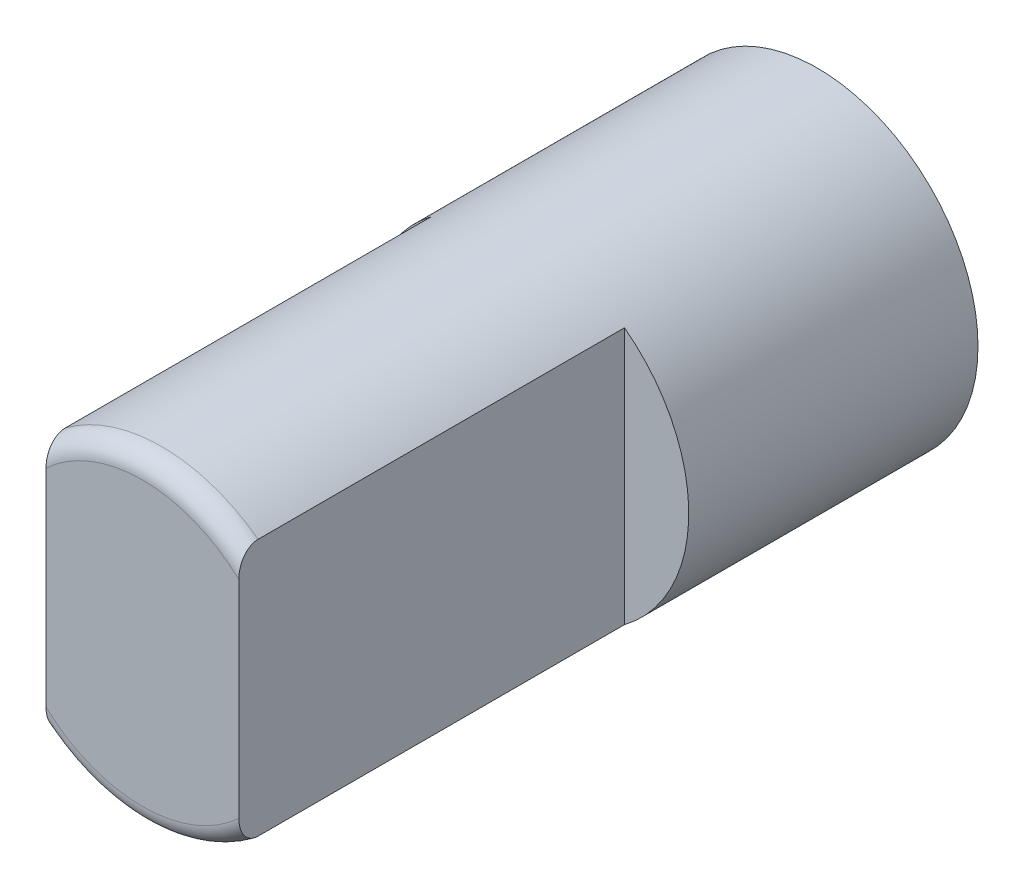
ISO-10303-21;
HEADER;
FILE_DESCRIPTION(('STEP AP214'),'2;1');
FILE_NAME('part.step','',(''),(''),'','','');
FILE_SCHEMA(('AUTOMOTIVE_DESIGN { 1 0 10303 214 1 1 1 1 }'));
ENDSEC;
DATA;
#1=APPLICATION_CONTEXT('core data for automotive mechanical design processes');
#2=APPLICATION_PROTOCOL_DEFINITION('international standard','automotive_design',2000,#1);
#3=PRODUCT_CONTEXT('',#1,'mechanical');
#4=PRODUCT('Part','Part','',(#3));
#5=PRODUCT_RELATED_PRODUCT_CATEGORY('part','',(#4));
#6=PRODUCT_DEFINITION_FORMATION('','',#4);
#7=PRODUCT_DEFINITION_CONTEXT('part definition',#1,'design');
#8=PRODUCT_DEFINITION('design','',#6,#7);
#9=PRODUCT_DEFINITION_SHAPE('','',#8);
#10=(LENGTH_UNIT() NAMED_UNIT(*) SI_UNIT(.MILLI.,.METRE.));
#11=(NAMED_UNIT(*) PLANE_ANGLE_UNIT() SI_UNIT($,.RADIAN.));
#12=(NAMED_UNIT(*) SI_UNIT($,.STERADIAN.) SOLID_ANGLE_UNIT());
#13=UNCERTAINTY_MEASURE_WITH_UNIT(LENGTH_MEASURE(1.E-05),#10,'distance_accuracy_value','');
#14=(GEOMETRIC_REPRESENTATION_CONTEXT(3) GLOBAL_UNCERTAINTY_ASSIGNED_CONTEXT((#13)) GLOBAL_UNIT_ASSIGNED_CONTEXT((#10,
#11,#12)) REPRESENTATION_CONTEXT('',''));
#15=CARTESIAN_POINT('',(0.,0.,0.));
#16=DIRECTION('',(0.,0.,1.));
#17=DIRECTION('',(1.,0.,0.));
#18=AXIS2_PLACEMENT_3D('',#15,#16,#17);
#19=CARTESIAN_POINT('',(0.,0.,10.5));
#20=DIRECTION('',(0.,0.,-1.));
#21=DIRECTION('',(-1.,0.,0.));
#22=AXIS2_PLACEMENT_3D('',#19,#20,#21);
#23=CYLINDRICAL_SURFACE('',#22,2.5);
#24=DIRECTION('',(0.,0.,1.));
#25=VECTOR('',#24,1.);
#26=CARTESIAN_POINT('',(-1.5,2.,4.5));
#27=LINE('',#26,#25);
#28=CARTESIAN_POINT('',(-1.5,2.,4.5));
#29=VERTEX_POINT('',#28);
#30=CARTESIAN_POINT('',(-1.5,2.,10.2));
#31=VERTEX_POINT('',#30);
#32=EDGE_CURVE('E120',#29,#31,#27,.T.);
#33=ORIENTED_EDGE('',*,*,#32,.T.);
#34=CARTESIAN_POINT('',(0.,0.,10.2));
#35=DIRECTION('',(0.,0.,1.));
#36=DIRECTION('',(1.,0.,0.));
#37=AXIS2_PLACEMENT_3D('',#34,#35,#36);
#38=CIRCLE('',#37,2.5);
#39=CARTESIAN_POINT('',(1.5,2.,10.2));
#40=VERTEX_POINT('',#39);
#41=EDGE_CURVE('E64',#31,#40,#38,.F.);
#42=ORIENTED_EDGE('',*,*,#41,.T.);
#43=DIRECTION('',(0.,0.,1.));
#44=VECTOR('',#43,1.);
#45=CARTESIAN_POINT('',(1.5,2.,4.5));
#46=LINE('',#45,#44);
#47=CARTESIAN_POINT('',(1.5,2.,4.5));
#48=VERTEX_POINT('',#47);
#49=EDGE_CURVE('E102',#48,#40,#46,.T.);
#50=ORIENTED_EDGE('',*,*,#49,.F.);
#51=CARTESIAN_POINT('',(0.,0.,4.5));
#52=DIRECTION('',(0.,0.,1.));
#53=DIRECTION('',(1.,0.,0.));
#54=AXIS2_PLACEMENT_3D('',#51,#52,#53);
#55=CIRCLE('',#54,2.5);
#56=CARTESIAN_POINT('',(1.5,-2.,4.5));
#57=VERTEX_POINT('',#56);
#58=EDGE_CURVE('E95',#57,#48,#55,.T.);
#59=ORIENTED_EDGE('',*,*,#58,.F.);
#60=DIRECTION('',(0.,0.,1.));
#61=VECTOR('',#60,1.);
#62=CARTESIAN_POINT('',(1.5,-2.,4.5));
#63=LINE('',#62,#61);
#64=CARTESIAN_POINT('',(1.5,-2.,10.2));
#65=VERTEX_POINT('',#64);
#66=EDGE_CURVE('E104',#57,#65,#63,.T.);
#67=ORIENTED_EDGE('',*,*,#66,.T.);
#68=CARTESIAN_POINT('',(0.,0.,10.2));
#69=DIRECTION('',(0.,0.,1.));
#70=DIRECTION('',(1.,0.,0.));
#71=AXIS2_PLACEMENT_3D('',#68,#69,#70);
#72=CIRCLE('',#71,2.5);
#73=CARTESIAN_POINT('',(-1.5,-2.,10.2));
#74=VERTEX_POINT('',#73);
#75=EDGE_CURVE('E178',#65,#74,#72,.F.);
#76=ORIENTED_EDGE('',*,*,#75,.T.);
#77=DIRECTION('',(0.,0.,1.));
#78=VECTOR('',#77,1.);
#79=CARTESIAN_POINT('',(-1.5,-2.,4.5));
#80=LINE('',#79,#78);
#81=CARTESIAN_POINT('',(-1.5,-2.,4.5));
#82=VERTEX_POINT('',#81);
#83=EDGE_CURVE('E117',#82,#74,#80,.T.);
#84=ORIENTED_EDGE('',*,*,#83,.F.);
#85=CARTESIAN_POINT('',(0.,0.,4.5));
#86=DIRECTION('',(0.,0.,1.));
#87=DIRECTION('',(1.,0.,0.));
#88=AXIS2_PLACEMENT_3D('',#85,#86,#87);
#89=CIRCLE('',#88,2.5);
#90=EDGE_CURVE('E112',#29,#82,#89,.T.);
#91=ORIENTED_EDGE('',*,*,#90,.F.);
#92=EDGE_LOOP('',(#33,#42,#50,#59,#67,#76,#84,#91));
#93=FACE_BOUND('',#92,.T.);
#94=CARTESIAN_POINT('',(0.,0.,0.));
#95=DIRECTION('',(0.,0.,1.));
#96=DIRECTION('',(1.,0.,0.));
#97=AXIS2_PLACEMENT_3D('',#94,#95,#96);
#98=CIRCLE('',#97,2.5);
#99=CARTESIAN_POINT('',(2.5,0.,0.));
#100=VERTEX_POINT('',#99);
#101=EDGE_CURVE('E122',#100,#100,#98,.T.);
#102=ORIENTED_EDGE('',*,*,#101,.T.);
#103=EDGE_LOOP('',(#102));
#104=FACE_BOUND('',#103,.T.);
#105=ADVANCED_FACE('F37',(#93,#104),#23,.T.);
#106=CARTESIAN_POINT('',(0.,0.,10.5));
#107=DIRECTION('',(0.,0.,1.));
#108=DIRECTION('',(1.,0.,0.));
#109=AXIS2_PLACEMENT_3D('',#106,#107,#108);
#110=PLANE('',#109);
#111=DIRECTION('',(0.,-1.,0.));
#112=VECTOR('',#111,1.);
#113=CARTESIAN_POINT('',(1.5,2.,10.5));
#114=LINE('',#113,#112);
#115=CARTESIAN_POINT('',(1.5,1.60934769394311,10.5));
#116=VERTEX_POINT('',#115);
#117=CARTESIAN_POINT('',(1.5,-1.60934769394311,10.5));
#118=VERTEX_POINT('',#117);
#119=EDGE_CURVE('E99',#116,#118,#114,.T.);
#120=ORIENTED_EDGE('',*,*,#119,.F.);
#121=CARTESIAN_POINT('',(0.,0.,10.5));
#122=DIRECTION('',(0.,0.,1.));
#123=DIRECTION('',(1.,0.,0.));
#124=AXIS2_PLACEMENT_3D('',#121,#122,#123);
#125=CIRCLE('',#124,2.2);
#126=CARTESIAN_POINT('',(-1.5,1.60934769394311,10.5));
#127=VERTEX_POINT('',#126);
#128=EDGE_CURVE('E130',#116,#127,#125,.T.);
#129=ORIENTED_EDGE('',*,*,#128,.T.);
#130=DIRECTION('',(0.,1.,0.));
#131=VECTOR('',#130,1.);
#132=CARTESIAN_POINT('',(-1.5,-2.,10.5));
#133=LINE('',#132,#131);
#134=CARTESIAN_POINT('',(-1.5,-1.60934769394311,10.5));
#135=VERTEX_POINT('',#134);
#136=EDGE_CURVE('E108',#135,#127,#133,.T.);
#137=ORIENTED_EDGE('',*,*,#136,.F.);
#138=CARTESIAN_POINT('',(0.,0.,10.5));
#139=DIRECTION('',(0.,0.,1.));
#140=DIRECTION('',(1.,0.,0.));
#141=AXIS2_PLACEMENT_3D('',#138,#139,#140);
#142=CIRCLE('',#141,2.2);
#143=EDGE_CURVE('E127',#135,#118,#142,.T.);
#144=ORIENTED_EDGE('',*,*,#143,.T.);
#145=EDGE_LOOP('',(#120,#129,#137,#144));
#146=FACE_BOUND('',#145,.T.);
#147=ADVANCED_FACE('F152',(#146),#110,.T.);
#148=CARTESIAN_POINT('',(0.,0.,0.));
#149=DIRECTION('',(0.,0.,1.));
#150=DIRECTION('',(1.,0.,0.));
#151=AXIS2_PLACEMENT_3D('',#148,#149,#150);
#152=PLANE('',#151);
#153=ORIENTED_EDGE('',*,*,#101,.F.);
#154=EDGE_LOOP('',(#153));
#155=FACE_BOUND('',#154,.T.);
#156=ADVANCED_FACE('F150',(#155),#152,.F.);
#157=CARTESIAN_POINT('',(-1.5,-2.,4.5));
#158=DIRECTION('',(1.,0.,0.));
#159=DIRECTION('',(0.,0.,-1.));
#160=AXIS2_PLACEMENT_3D('',#157,#158,#159);
#161=PLANE('',#160);
#162=ORIENTED_EDGE('',*,*,#136,.T.);
#163=CARTESIAN_POINT('',(-1.5,1.60934769394311,10.5));
#164=CARTESIAN_POINT('',(-1.5,1.63455756088802,10.4999930365524));
#165=CARTESIAN_POINT('',(-1.5,1.65983567369953,10.4982965539345));
#166=CARTESIAN_POINT('',(-1.5,1.71006444420656,10.4911978020638));
#167=CARTESIAN_POINT('',(-1.5,1.73501082564339,10.485765800347));
#168=CARTESIAN_POINT('',(-1.5,1.78015920378003,10.4719391103205));
#169=CARTESIAN_POINT('',(-1.5,1.80052499490785,10.4640875692299));
#170=CARTESIAN_POINT('',(-1.5,1.83971397031135,10.4452521364515));
#171=CARTESIAN_POINT('',(-1.5,1.85854156598494,10.4342776383488));
#172=CARTESIAN_POINT('',(-1.5,1.89041710668386,10.4115782676907));
#173=CARTESIAN_POINT('',(-1.5,1.90387281174314,10.4004275954057));
#174=CARTESIAN_POINT('',(-1.5,1.92879524167868,10.3760722511314));
#175=CARTESIAN_POINT('',(-1.5,1.94026321503409,10.3628688783869));
#176=CARTESIAN_POINT('',(-1.5,1.95908459464518,10.3367361609004));
#177=CARTESIAN_POINT('',(-1.5,1.96679780893242,10.3240664290926));
#178=CARTESIAN_POINT('',(-1.5,1.98000101437779,10.2976250572571));
#179=CARTESIAN_POINT('',(-1.5,1.98549441608471,10.2838551468498));
#180=CARTESIAN_POINT('',(-1.5,1.99309951243727,10.2584335740684));
#181=CARTESIAN_POINT('',(-1.5,1.99567095993214,10.2469182805731));
#182=CARTESIAN_POINT('',(-1.5,1.99912887456355,10.2236061892701));
#183=CARTESIAN_POINT('',(-1.5,2.00001067938499,10.2118087032326));
#184=CARTESIAN_POINT('',(-1.5,2.,10.2));
#185=B_SPLINE_CURVE_WITH_KNOTS('',3,(#163,#164,#165,#166,#167,#168,#169,#170,#171,#172,#173,
#174,#175,#176,#177,#178,#179,#180,#181,#182,#183,#184),.UNSPECIFIED.,.F.,.F.,(4,2,2,2,2,2,2,2,
2,2,4),(0.,0.0756831664616083,0.151975804988488,0.217216943562001,0.282263879933907,
0.334490581993891,0.386684361045045,0.43099770793193,0.475242709959179,0.510519640253401,
0.545893772543511),.UNSPECIFIED.);
#186=EDGE_CURVE('E139',#127,#31,#185,.T.);
#187=ORIENTED_EDGE('',*,*,#186,.T.);
#188=ORIENTED_EDGE('',*,*,#32,.F.);
#189=DIRECTION('',(0.,1.,0.));
#190=VECTOR('',#189,1.);
#191=CARTESIAN_POINT('',(-1.5,-2.,4.5));
#192=LINE('',#191,#190);
#193=EDGE_CURVE('E114',#82,#29,#192,.T.);
#194=ORIENTED_EDGE('',*,*,#193,.F.);
#195=ORIENTED_EDGE('',*,*,#83,.T.);
#196=CARTESIAN_POINT('',(-1.5,-2.,10.2));
#197=CARTESIAN_POINT('',(-1.5,-2.00002517455878,10.2144056996334));
#198=CARTESIAN_POINT('',(-1.5,-1.99870486599517,10.2287902734827));
#199=CARTESIAN_POINT('',(-1.5,-1.99358070321942,10.2570308291312));
#200=CARTESIAN_POINT('',(-1.5,-1.98979069108125,10.2708893041524));
#201=CARTESIAN_POINT('',(-1.5,-1.97993698735774,10.2977426754332));
#202=CARTESIAN_POINT('',(-1.5,-1.97387630854318,10.3107386892477));
#203=CARTESIAN_POINT('',(-1.5,-1.95978432211314,10.3356228880546));
#204=CARTESIAN_POINT('',(-1.5,-1.9517507082177,10.3475097538949));
#205=CARTESIAN_POINT('',(-1.5,-1.93348662795761,10.3706924605465));
#206=CARTESIAN_POINT('',(-1.5,-1.92314966060003,10.381903914782));
#207=CARTESIAN_POINT('',(-1.5,-1.90101243976691,10.4027555610775));
#208=CARTESIAN_POINT('',(-1.5,-1.88921201923138,10.4123955734589));
#209=CARTESIAN_POINT('',(-1.5,-1.85874706020155,10.4341885855466));
#210=CARTESIAN_POINT('',(-1.5,-1.83943396820596,10.4454387541662));
#211=CARTESIAN_POINT('',(-1.5,-1.79919162836747,10.4646739873788));
#212=CARTESIAN_POINT('',(-1.5,-1.77825631616834,10.4726460208116));
#213=CARTESIAN_POINT('',(-1.5,-1.73288707269971,10.486260588626));
#214=CARTESIAN_POINT('',(-1.5,-1.70833590606525,10.4915056696061));
#215=CARTESIAN_POINT('',(-1.5,-1.65894868973323,10.4983557383456));
#216=CARTESIAN_POINT('',(-1.5,-1.63411722198948,10.4999932051289));
#217=CARTESIAN_POINT('',(-1.5,-1.60934769394311,10.5));
#218=B_SPLINE_CURVE_WITH_KNOTS('',3,(#196,#197,#198,#199,#200,#201,#202,#203,#204,#205,#206,
#207,#208,#209,#210,#211,#212,#213,#214,#215,#216,#217),.UNSPECIFIED.,.F.,.F.,(4,2,2,2,2,2,2,2,
2,2,4),(0.,0.0431233888911273,0.086007136978675,0.128834186314012,0.171711539014381,
0.217289611231089,0.262872891194265,0.329559981731445,0.396509660474081,0.471542406056419,
0.545896829848013),.UNSPECIFIED.);
#219=EDGE_CURVE('E133',#74,#135,#218,.T.);
#220=ORIENTED_EDGE('',*,*,#219,.T.);
#221=EDGE_LOOP('',(#162,#187,#188,#194,#195,#220));
#222=FACE_BOUND('',#221,.T.);
#223=ADVANCED_FACE('F144',(#222),#161,.F.);
#224=CARTESIAN_POINT('',(0.,0.,4.5));
#225=DIRECTION('',(0.,0.,1.));
#226=DIRECTION('',(1.,0.,0.));
#227=AXIS2_PLACEMENT_3D('',#224,#225,#226);
#228=PLANE('',#227);
#229=ORIENTED_EDGE('',*,*,#90,.T.);
#230=ORIENTED_EDGE('',*,*,#193,.T.);
#231=EDGE_LOOP('',(#229,#230));
#232=FACE_BOUND('',#231,.T.);
#233=ADVANCED_FACE('F149',(#232),#228,.T.);
#234=CARTESIAN_POINT('',(1.5,2.,4.5));
#235=DIRECTION('',(-1.,0.,0.));
#236=DIRECTION('',(0.,0.,1.));
#237=AXIS2_PLACEMENT_3D('',#234,#235,#236);
#238=PLANE('',#237);
#239=ORIENTED_EDGE('',*,*,#49,.T.);
#240=CARTESIAN_POINT('',(1.5,2.,10.2));
#241=CARTESIAN_POINT('',(1.5,2.00002517455878,10.2144056996334));
#242=CARTESIAN_POINT('',(1.5,1.99870486599517,10.2287902734827));
#243=CARTESIAN_POINT('',(1.5,1.99358070321942,10.2570308291312));
#244=CARTESIAN_POINT('',(1.5,1.98979069108125,10.2708893041524));
#245=CARTESIAN_POINT('',(1.5,1.97993698735774,10.2977426754332));
#246=CARTESIAN_POINT('',(1.5,1.97387630854318,10.3107386892477));
#247=CARTESIAN_POINT('',(1.5,1.95978432211314,10.3356228880546));
#248=CARTESIAN_POINT('',(1.5,1.9517507082177,10.3475097538949));
#249=CARTESIAN_POINT('',(1.5,1.93348662795761,10.3706924605465));
#250=CARTESIAN_POINT('',(1.5,1.92314966060003,10.381903914782));
#251=CARTESIAN_POINT('',(1.5,1.90101243976691,10.4027555610775));
#252=CARTESIAN_POINT('',(1.5,1.88921201923138,10.4123955734589));
#253=CARTESIAN_POINT('',(1.5,1.85874706020155,10.4341885855466));
#254=CARTESIAN_POINT('',(1.5,1.83943396820596,10.4454387541662));
#255=CARTESIAN_POINT('',(1.5,1.79919162836747,10.4646739873788));
#256=CARTESIAN_POINT('',(1.5,1.77825631616834,10.4726460208116));
#257=CARTESIAN_POINT('',(1.5,1.73288707269971,10.486260588626));
#258=CARTESIAN_POINT('',(1.5,1.70833590606525,10.4915056696061));
#259=CARTESIAN_POINT('',(1.5,1.65894868973323,10.4983557383456));
#260=CARTESIAN_POINT('',(1.5,1.63411722198948,10.4999932051289));
#261=CARTESIAN_POINT('',(1.5,1.60934769394311,10.5));
#262=B_SPLINE_CURVE_WITH_KNOTS('',3,(#240,#241,#242,#243,#244,#245,#246,#247,#248,#249,#250,
#251,#252,#253,#254,#255,#256,#257,#258,#259,#260,#261),.UNSPECIFIED.,.F.,.F.,(4,2,2,2,2,2,2,2,
2,2,4),(0.,0.0431233888911273,0.086007136978675,0.128834186314012,0.171711539014381,
0.217289611231089,0.262872891194265,0.329559981731445,0.396509660474081,0.471542406056419,
0.545896829848013),.UNSPECIFIED.);
#263=EDGE_CURVE('E11',#40,#116,#262,.T.);
#264=ORIENTED_EDGE('',*,*,#263,.T.);
#265=ORIENTED_EDGE('',*,*,#119,.T.);
#266=CARTESIAN_POINT('',(1.5,-1.60934769394311,10.5));
#267=CARTESIAN_POINT('',(1.5,-1.63455756088802,10.4999930365524));
#268=CARTESIAN_POINT('',(1.5,-1.65983567369953,10.4982965539345));
#269=CARTESIAN_POINT('',(1.5,-1.71006444420656,10.4911978020638));
#270=CARTESIAN_POINT('',(1.5,-1.73501082564339,10.485765800347));
#271=CARTESIAN_POINT('',(1.5,-1.78015920378003,10.4719391103205));
#272=CARTESIAN_POINT('',(1.5,-1.80052499490785,10.4640875692299));
#273=CARTESIAN_POINT('',(1.5,-1.83971397031135,10.4452521364515));
#274=CARTESIAN_POINT('',(1.5,-1.85854156598494,10.4342776383488));
#275=CARTESIAN_POINT('',(1.5,-1.89041710668386,10.4115782676907));
#276=CARTESIAN_POINT('',(1.5,-1.90387281174314,10.4004275954057));
#277=CARTESIAN_POINT('',(1.5,-1.92879524167868,10.3760722511314));
#278=CARTESIAN_POINT('',(1.5,-1.94026321503409,10.3628688783869));
#279=CARTESIAN_POINT('',(1.5,-1.95908459464518,10.3367361609004));
#280=CARTESIAN_POINT('',(1.5,-1.96679780893242,10.3240664290926));
#281=CARTESIAN_POINT('',(1.5,-1.98000101437779,10.2976250572571));
#282=CARTESIAN_POINT('',(1.5,-1.98549441608471,10.2838551468498));
#283=CARTESIAN_POINT('',(1.5,-1.99309951243727,10.2584335740684));
#284=CARTESIAN_POINT('',(1.5,-1.99567095993214,10.2469182805731));
#285=CARTESIAN_POINT('',(1.5,-1.99912887456355,10.2236061892701));
#286=CARTESIAN_POINT('',(1.5,-2.00001067938499,10.2118087032326));
#287=CARTESIAN_POINT('',(1.5,-2.,10.2));
#288=B_SPLINE_CURVE_WITH_KNOTS('',3,(#266,#267,#268,#269,#270,#271,#272,#273,#274,#275,#276,
#277,#278,#279,#280,#281,#282,#283,#284,#285,#286,#287),.UNSPECIFIED.,.F.,.F.,(4,2,2,2,2,2,2,2,
2,2,4),(0.,0.0756831664616083,0.151975804988488,0.217216943562001,0.282263879933907,
0.334490581993891,0.386684361045045,0.43099770793193,0.475242709959179,0.510519640253401,
0.545893772543511),.UNSPECIFIED.);
#289=EDGE_CURVE('E50',#118,#65,#288,.T.);
#290=ORIENTED_EDGE('',*,*,#289,.T.);
#291=ORIENTED_EDGE('',*,*,#66,.F.);
#292=DIRECTION('',(0.,-1.,0.));
#293=VECTOR('',#292,1.);
#294=CARTESIAN_POINT('',(1.5,2.,4.5));
#295=LINE('',#294,#293);
#296=EDGE_CURVE('E98',#48,#57,#295,.T.);
#297=ORIENTED_EDGE('',*,*,#296,.F.);
#298=EDGE_LOOP('',(#239,#264,#265,#290,#291,#297));
#299=FACE_BOUND('',#298,.T.);
#300=ADVANCED_FACE('F101',(#299),#238,.F.);
#301=CARTESIAN_POINT('',(0.,0.,4.5));
#302=DIRECTION('',(0.,0.,1.));
#303=DIRECTION('',(1.,0.,0.));
#304=AXIS2_PLACEMENT_3D('',#301,#302,#303);
#305=PLANE('',#304);
#306=ORIENTED_EDGE('',*,*,#58,.T.);
#307=ORIENTED_EDGE('',*,*,#296,.T.);
#308=EDGE_LOOP('',(#306,#307));
#309=FACE_BOUND('',#308,.T.);
#310=ADVANCED_FACE('F97',(#309),#305,.T.);
#311=CARTESIAN_POINT('',(0.,0.,10.2));
#312=DIRECTION('',(0.,0.,1.));
#313=DIRECTION('',(1.,0.,0.));
#314=AXIS2_PLACEMENT_3D('',#311,#312,#313);
#315=TOROIDAL_SURFACE('',#314,2.2,0.3);
#316=ORIENTED_EDGE('',*,*,#263,.F.);
#317=ORIENTED_EDGE('',*,*,#41,.F.);
#318=ORIENTED_EDGE('',*,*,#186,.F.);
#319=ORIENTED_EDGE('',*,*,#128,.F.);
#320=EDGE_LOOP('',(#316,#317,#318,#319));
#321=FACE_BOUND('',#320,.T.);
#322=ADVANCED_FACE('F161',(#321),#315,.T.);
#323=CARTESIAN_POINT('',(0.,0.,10.2));
#324=DIRECTION('',(0.,0.,1.));
#325=DIRECTION('',(1.,0.,0.));
#326=AXIS2_PLACEMENT_3D('',#323,#324,#325);
#327=TOROIDAL_SURFACE('',#326,2.2,0.3);
#328=ORIENTED_EDGE('',*,*,#219,.F.);
#329=ORIENTED_EDGE('',*,*,#75,.F.);
#330=ORIENTED_EDGE('',*,*,#289,.F.);
#331=ORIENTED_EDGE('',*,*,#143,.F.);
#332=EDGE_LOOP('',(#328,#329,#330,#331));
#333=FACE_BOUND('',#332,.T.);
#334=ADVANCED_FACE('F39',(#333),#327,.T.);
#335=CLOSED_SHELL('',(#105,#147,#156,#223,#233,#300,#310,#322,#334));
#336=MANIFOLD_SOLID_BREP('B2',#335);
#337=ADVANCED_BREP_SHAPE_REPRESENTATION('',(#18,#336),#14);
#338=SHAPE_DEFINITION_REPRESENTATION(#9,#337);
ENDSEC;
END-ISO-10303-21;
